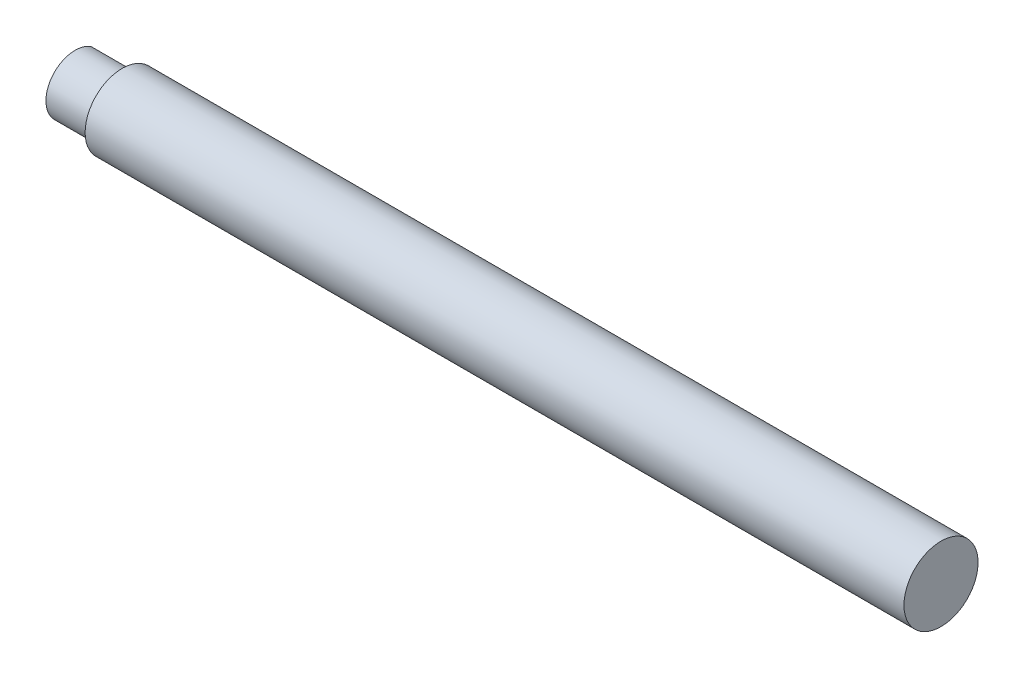
ISO-10303-21;
HEADER;
FILE_DESCRIPTION(('STEP AP214'),'2;1');
FILE_NAME('part.step','',(''),(''),'','','');
FILE_SCHEMA(('AUTOMOTIVE_DESIGN { 1 0 10303 214 1 1 1 1 }'));
ENDSEC;
DATA;
#1=APPLICATION_CONTEXT('core data for automotive mechanical design processes');
#2=APPLICATION_PROTOCOL_DEFINITION('international standard','automotive_design',2000,#1);
#3=PRODUCT_CONTEXT('',#1,'mechanical');
#4=PRODUCT('Part','Part','',(#3));
#5=PRODUCT_RELATED_PRODUCT_CATEGORY('part','',(#4));
#6=PRODUCT_DEFINITION_FORMATION('','',#4);
#7=PRODUCT_DEFINITION_CONTEXT('part definition',#1,'design');
#8=PRODUCT_DEFINITION('design','',#6,#7);
#9=PRODUCT_DEFINITION_SHAPE('','',#8);
#10=(LENGTH_UNIT() NAMED_UNIT(*) SI_UNIT(.MILLI.,.METRE.));
#11=(NAMED_UNIT(*) PLANE_ANGLE_UNIT() SI_UNIT($,.RADIAN.));
#12=(NAMED_UNIT(*) SI_UNIT($,.STERADIAN.) SOLID_ANGLE_UNIT());
#13=UNCERTAINTY_MEASURE_WITH_UNIT(LENGTH_MEASURE(1.E-05),#10,'distance_accuracy_value','');
#14=(GEOMETRIC_REPRESENTATION_CONTEXT(3) GLOBAL_UNCERTAINTY_ASSIGNED_CONTEXT((#13)) GLOBAL_UNIT_ASSIGNED_CONTEXT((#10,
#11,#12)) REPRESENTATION_CONTEXT('',''));
#15=CARTESIAN_POINT('',(0.,0.,0.));
#16=DIRECTION('',(0.,0.,1.));
#17=DIRECTION('',(1.,0.,0.));
#18=AXIS2_PLACEMENT_3D('',#15,#16,#17);
#19=CARTESIAN_POINT('',(58.42,0.,0.));
#20=DIRECTION('',(-1.,0.,0.));
#21=DIRECTION('',(0.,0.,1.));
#22=AXIS2_PLACEMENT_3D('',#19,#20,#21);
#23=CYLINDRICAL_SURFACE('',#22,2.5);
#24=CARTESIAN_POINT('',(3.175,0.,0.));
#25=DIRECTION('',(1.,0.,0.));
#26=DIRECTION('',(0.,0.,-1.));
#27=AXIS2_PLACEMENT_3D('',#24,#25,#26);
#28=CIRCLE('',#27,2.5);
#29=CARTESIAN_POINT('',(3.175,0.,2.5));
#30=VERTEX_POINT('',#29);
#31=EDGE_CURVE('E37',#30,#30,#28,.T.);
#32=CARTESIAN_POINT('',(58.42,0.,0.));
#33=DIRECTION('',(1.,0.,0.));
#34=DIRECTION('',(0.,0.,-1.));
#35=AXIS2_PLACEMENT_3D('',#32,#33,#34);
#36=CIRCLE('',#35,2.5);
#37=CARTESIAN_POINT('',(58.42,0.,2.5));
#38=VERTEX_POINT('',#37);
#39=EDGE_CURVE('E12',#38,#38,#36,.T.);
#40=CARTESIAN_POINT('',(3.175,0.,2.5));
#41=CARTESIAN_POINT('',(3.75046875,0.,2.5));
#42=CARTESIAN_POINT('',(4.3259375,0.,2.5));
#43=CARTESIAN_POINT('',(5.476875,0.,2.5));
#44=CARTESIAN_POINT('',(6.05234375,0.,2.5));
#45=CARTESIAN_POINT('',(7.20328125,0.,2.5));
#46=CARTESIAN_POINT('',(7.77875,0.,2.5));
#47=CARTESIAN_POINT('',(8.9296875,0.,2.5));
#48=CARTESIAN_POINT('',(9.50515625,0.,2.5));
#49=CARTESIAN_POINT('',(10.65609375,0.,2.5));
#50=CARTESIAN_POINT('',(11.2315625,0.,2.5));
#51=CARTESIAN_POINT('',(12.3825,0.,2.5));
#52=CARTESIAN_POINT('',(12.95796875,0.,2.5));
#53=CARTESIAN_POINT('',(14.10890625,0.,2.5));
#54=CARTESIAN_POINT('',(14.684375,0.,2.5));
#55=CARTESIAN_POINT('',(15.8353125,0.,2.5));
#56=CARTESIAN_POINT('',(16.41078125,0.,2.5));
#57=CARTESIAN_POINT('',(17.56171875,0.,2.5));
#58=CARTESIAN_POINT('',(18.1371875,0.,2.5));
#59=CARTESIAN_POINT('',(19.288125,0.,2.5));
#60=CARTESIAN_POINT('',(19.86359375,0.,2.5));
#61=CARTESIAN_POINT('',(21.01453125,0.,2.5));
#62=CARTESIAN_POINT('',(21.59,0.,2.5));
#63=CARTESIAN_POINT('',(22.7409375,0.,2.5));
#64=CARTESIAN_POINT('',(23.31640625,0.,2.5));
#65=CARTESIAN_POINT('',(24.46734375,0.,2.5));
#66=CARTESIAN_POINT('',(25.0428125,0.,2.5));
#67=CARTESIAN_POINT('',(26.19375,0.,2.5));
#68=CARTESIAN_POINT('',(26.76921875,0.,2.5));
#69=CARTESIAN_POINT('',(27.92015625,0.,2.5));
#70=CARTESIAN_POINT('',(28.495625,0.,2.5));
#71=CARTESIAN_POINT('',(29.6465625,0.,2.5));
#72=CARTESIAN_POINT('',(30.22203125,0.,2.5));
#73=CARTESIAN_POINT('',(31.37296875,0.,2.5));
#74=CARTESIAN_POINT('',(31.9484375,0.,2.5));
#75=CARTESIAN_POINT('',(33.099375,0.,2.5));
#76=CARTESIAN_POINT('',(33.67484375,0.,2.5));
#77=CARTESIAN_POINT('',(34.82578125,0.,2.5));
#78=CARTESIAN_POINT('',(35.40125,0.,2.5));
#79=CARTESIAN_POINT('',(36.5521875,0.,2.5));
#80=CARTESIAN_POINT('',(37.12765625,0.,2.5));
#81=CARTESIAN_POINT('',(38.27859375,0.,2.5));
#82=CARTESIAN_POINT('',(38.8540625,0.,2.5));
#83=CARTESIAN_POINT('',(40.005,0.,2.5));
#84=CARTESIAN_POINT('',(40.58046875,0.,2.5));
#85=CARTESIAN_POINT('',(41.73140625,0.,2.5));
#86=CARTESIAN_POINT('',(42.306875,0.,2.5));
#87=CARTESIAN_POINT('',(43.4578125,0.,2.5));
#88=CARTESIAN_POINT('',(44.03328125,0.,2.5));
#89=CARTESIAN_POINT('',(45.18421875,0.,2.5));
#90=CARTESIAN_POINT('',(45.7596875,0.,2.5));
#91=CARTESIAN_POINT('',(46.910625,0.,2.5));
#92=CARTESIAN_POINT('',(47.48609375,0.,2.5));
#93=CARTESIAN_POINT('',(48.63703125,0.,2.5));
#94=CARTESIAN_POINT('',(49.2125,0.,2.5));
#95=CARTESIAN_POINT('',(50.3634375,0.,2.5));
#96=CARTESIAN_POINT('',(50.93890625,0.,2.5));
#97=CARTESIAN_POINT('',(52.08984375,0.,2.5));
#98=CARTESIAN_POINT('',(52.6653125,0.,2.5));
#99=CARTESIAN_POINT('',(53.81625,0.,2.5));
#100=CARTESIAN_POINT('',(54.39171875,0.,2.5));
#101=CARTESIAN_POINT('',(55.54265625,0.,2.5));
#102=CARTESIAN_POINT('',(56.118125,0.,2.5));
#103=CARTESIAN_POINT('',(57.2690625,0.,2.5));
#104=CARTESIAN_POINT('',(57.84453125,0.,2.5));
#105=CARTESIAN_POINT('',(58.42,0.,2.5));
#106=B_SPLINE_CURVE_WITH_KNOTS('',3,(#40,#41,#42,#43,#44,#45,#46,#47,#48,#49,#50,#51,#52,#53,
#54,#55,#56,#57,#58,#59,#60,#61,#62,#63,#64,#65,#66,#67,#68,#69,#70,#71,#72,#73,#74,#75,#76,#77,
#78,#79,#80,#81,#82,#83,#84,#85,#86,#87,#88,#89,#90,#91,#92,#93,#94,#95,#96,#97,#98,#99,#100,
#101,#102,#103,#104,#105),.UNSPECIFIED.,.F.,.F.,(4,2,2,2,2,2,2,2,2,2,2,2,2,2,2,2,2,2,2,2,2,2,2,
2,2,2,2,2,2,2,2,2,4),(0.,1.72640625,3.4528125,5.17921875,6.905625,8.63203125,10.3584375,
12.08484375,13.81125,15.53765625,17.2640625,18.99046875,20.716875,22.44328125,24.1696875,
25.89609375,27.6225,29.34890625,31.0753125,32.80171875,34.528125,36.25453125,37.9809375,
39.70734375,41.43375,43.16015625,44.8865625,46.61296875,48.339375,50.06578125,51.7921875,
53.51859375,55.245),.UNSPECIFIED.);
#107=EDGE_CURVE('BSEAM34',#30,#38,#106,.T.);
#108=ORIENTED_EDGE('',*,*,#31,.T.);
#109=ORIENTED_EDGE('',*,*,#39,.F.);
#110=ORIENTED_EDGE('',*,*,#107,.T.);
#111=ORIENTED_EDGE('',*,*,#107,.F.);
#112=EDGE_LOOP('',(#108,#110,#109,#111));
#113=FACE_BOUND('',#112,.T.);
#114=ADVANCED_FACE('F34',(#113),#23,.T.);
#115=CARTESIAN_POINT('',(58.42,0.,0.));
#116=DIRECTION('',(1.,0.,0.));
#117=DIRECTION('',(0.,0.,-1.));
#118=AXIS2_PLACEMENT_3D('',#115,#116,#117);
#119=PLANE('',#118);
#120=ORIENTED_EDGE('',*,*,#39,.T.);
#121=EDGE_LOOP('',(#120));
#122=FACE_BOUND('',#121,.T.);
#123=ADVANCED_FACE('F83',(#122),#119,.T.);
#124=CARTESIAN_POINT('',(3.175,0.,0.));
#125=DIRECTION('',(1.,0.,0.));
#126=DIRECTION('',(0.,0.,-1.));
#127=AXIS2_PLACEMENT_3D('',#124,#125,#126);
#128=PLANE('',#127);
#129=DIRECTION('',(0.,1.,0.));
#130=VECTOR('',#129,1.);
#131=CARTESIAN_POINT('',(3.175,1.6461081373956,-1.0795));
#132=LINE('',#131,#130);
#133=CARTESIAN_POINT('',(3.175,-1.6461081373956,-1.0795));
#134=VERTEX_POINT('',#133);
#135=CARTESIAN_POINT('',(3.175,1.6461081373956,-1.0795));
#136=VERTEX_POINT('',#135);
#137=EDGE_CURVE('E60',#134,#136,#132,.T.);
#138=ORIENTED_EDGE('',*,*,#137,.T.);
#139=CARTESIAN_POINT('',(3.175,0.,0.));
#140=DIRECTION('',(1.,0.,0.));
#141=DIRECTION('',(0.,0.,-1.));
#142=AXIS2_PLACEMENT_3D('',#139,#140,#141);
#143=CIRCLE('',#142,1.9685);
#144=EDGE_CURVE('E64',#136,#134,#143,.T.);
#145=ORIENTED_EDGE('',*,*,#144,.T.);
#146=EDGE_LOOP('',(#138,#145));
#147=FACE_BOUND('',#146,.T.);
#148=ORIENTED_EDGE('',*,*,#31,.F.);
#149=EDGE_LOOP('',(#148));
#150=FACE_BOUND('',#149,.T.);
#151=ADVANCED_FACE('F62',(#147,#150),#128,.F.);
#152=CARTESIAN_POINT('',(3.175,0.,0.));
#153=DIRECTION('',(-1.,0.,0.));
#154=DIRECTION('',(0.,0.,1.));
#155=AXIS2_PLACEMENT_3D('',#152,#153,#154);
#156=CYLINDRICAL_SURFACE('',#155,1.9685);
#157=CARTESIAN_POINT('',(0.,0.,0.));
#158=DIRECTION('',(1.,0.,0.));
#159=DIRECTION('',(0.,0.,-1.));
#160=AXIS2_PLACEMENT_3D('',#157,#158,#159);
#161=CIRCLE('',#160,1.9685);
#162=CARTESIAN_POINT('',(0.,1.6461081373956,-1.0795));
#163=VERTEX_POINT('',#162);
#164=CARTESIAN_POINT('',(0.,-1.6461081373956,-1.0795));
#165=VERTEX_POINT('',#164);
#166=EDGE_CURVE('E48',#163,#165,#161,.T.);
#167=ORIENTED_EDGE('',*,*,#166,.T.);
#168=DIRECTION('',(-1.,0.,0.));
#169=VECTOR('',#168,1.);
#170=CARTESIAN_POINT('',(3.175,-1.6461081373956,-1.0795));
#171=LINE('',#170,#169);
#172=EDGE_CURVE('E52',#134,#165,#171,.T.);
#173=ORIENTED_EDGE('',*,*,#172,.F.);
#174=ORIENTED_EDGE('',*,*,#144,.F.);
#175=DIRECTION('',(-1.,0.,0.));
#176=VECTOR('',#175,1.);
#177=CARTESIAN_POINT('',(3.175,1.6461081373956,-1.0795));
#178=LINE('',#177,#176);
#179=EDGE_CURVE('E66',#136,#163,#178,.T.);
#180=ORIENTED_EDGE('',*,*,#179,.T.);
#181=EDGE_LOOP('',(#167,#173,#174,#180));
#182=FACE_BOUND('',#181,.T.);
#183=ADVANCED_FACE('F73',(#182),#156,.T.);
#184=CARTESIAN_POINT('',(3.175,1.6461081373956,-1.0795));
#185=DIRECTION('',(0.,0.,1.));
#186=DIRECTION('',(1.,0.,0.));
#187=AXIS2_PLACEMENT_3D('',#184,#185,#186);
#188=PLANE('',#187);
#189=DIRECTION('',(0.,1.,0.));
#190=VECTOR('',#189,1.);
#191=CARTESIAN_POINT('',(0.,1.6461081373956,-1.0795));
#192=LINE('',#191,#190);
#193=EDGE_CURVE('E71',#165,#163,#192,.T.);
#194=ORIENTED_EDGE('',*,*,#193,.T.);
#195=ORIENTED_EDGE('',*,*,#179,.F.);
#196=ORIENTED_EDGE('',*,*,#137,.F.);
#197=ORIENTED_EDGE('',*,*,#172,.T.);
#198=EDGE_LOOP('',(#194,#195,#196,#197));
#199=FACE_BOUND('',#198,.T.);
#200=ADVANCED_FACE('F69',(#199),#188,.F.);
#201=CARTESIAN_POINT('',(0.,0.,0.));
#202=DIRECTION('',(1.,0.,0.));
#203=DIRECTION('',(0.,0.,-1.));
#204=AXIS2_PLACEMENT_3D('',#201,#202,#203);
#205=PLANE('',#204);
#206=ORIENTED_EDGE('',*,*,#193,.F.);
#207=ORIENTED_EDGE('',*,*,#166,.F.);
#208=EDGE_LOOP('',(#206,#207));
#209=FACE_BOUND('',#208,.T.);
#210=ADVANCED_FACE('F106',(#209),#205,.F.);
#211=CLOSED_SHELL('',(#114,#123,#151,#183,#200,#210));
#212=MANIFOLD_SOLID_BREP('B2',#211);
#213=ADVANCED_BREP_SHAPE_REPRESENTATION('',(#18,#212),#14);
#214=SHAPE_DEFINITION_REPRESENTATION(#9,#213);
ENDSEC;
END-ISO-10303-21;
